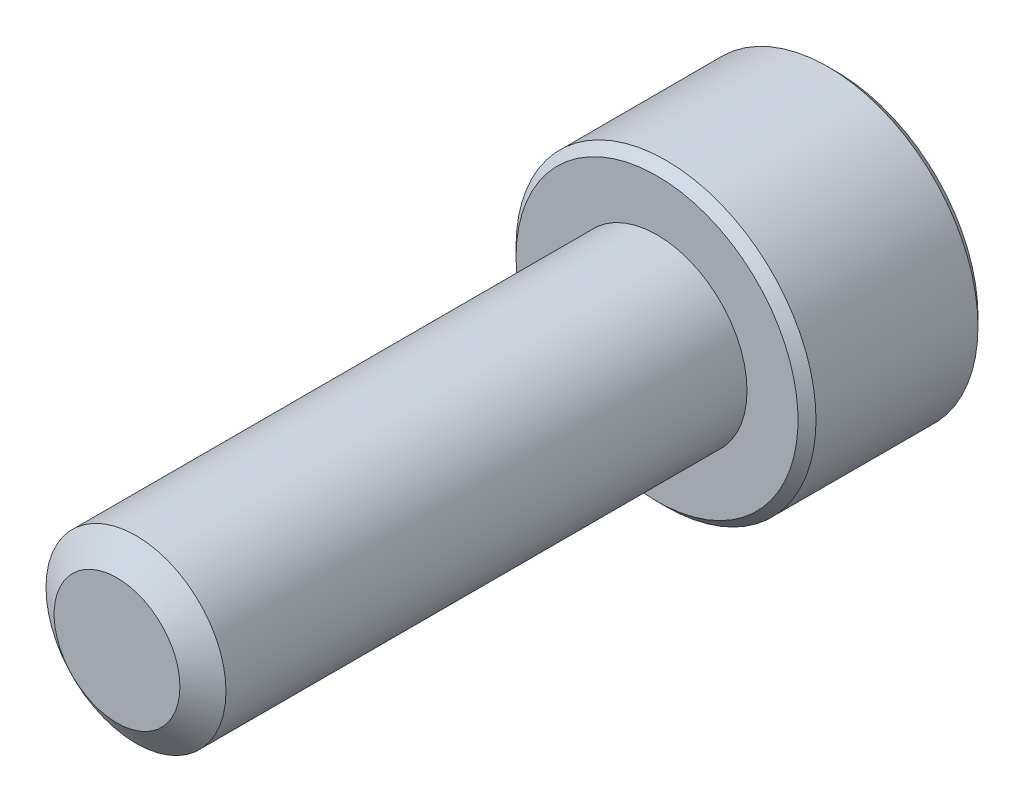
ISO-10303-21;
HEADER;
FILE_DESCRIPTION(('STEP AP214'),'2;1');
FILE_NAME('part.step','',(''),(''),'','','');
FILE_SCHEMA(('AUTOMOTIVE_DESIGN { 1 0 10303 214 1 1 1 1 }'));
ENDSEC;
DATA;
#1=APPLICATION_CONTEXT('core data for automotive mechanical design processes');
#2=APPLICATION_PROTOCOL_DEFINITION('international standard','automotive_design',2000,#1);
#3=PRODUCT_CONTEXT('',#1,'mechanical');
#4=PRODUCT('Part','Part','',(#3));
#5=PRODUCT_RELATED_PRODUCT_CATEGORY('part','',(#4));
#6=PRODUCT_DEFINITION_FORMATION('','',#4);
#7=PRODUCT_DEFINITION_CONTEXT('part definition',#1,'design');
#8=PRODUCT_DEFINITION('design','',#6,#7);
#9=PRODUCT_DEFINITION_SHAPE('','',#8);
#10=(LENGTH_UNIT() NAMED_UNIT(*) SI_UNIT(.MILLI.,.METRE.));
#11=(NAMED_UNIT(*) PLANE_ANGLE_UNIT() SI_UNIT($,.RADIAN.));
#12=(NAMED_UNIT(*) SI_UNIT($,.STERADIAN.) SOLID_ANGLE_UNIT());
#13=UNCERTAINTY_MEASURE_WITH_UNIT(LENGTH_MEASURE(1.E-05),#10,'distance_accuracy_value','');
#14=(GEOMETRIC_REPRESENTATION_CONTEXT(3) GLOBAL_UNCERTAINTY_ASSIGNED_CONTEXT((#13)) GLOBAL_UNIT_ASSIGNED_CONTEXT((#10,
#11,#12)) REPRESENTATION_CONTEXT('',''));
#15=CARTESIAN_POINT('',(0.,0.,0.));
#16=DIRECTION('',(0.,0.,1.));
#17=DIRECTION('',(1.,0.,0.));
#18=AXIS2_PLACEMENT_3D('',#15,#16,#17);
#19=CARTESIAN_POINT('',(0.,0.,-18.));
#20=DIRECTION('',(0.,0.,1.));
#21=DIRECTION('',(1.,0.,0.));
#22=AXIS2_PLACEMENT_3D('',#19,#20,#21);
#23=CYLINDRICAL_SURFACE('',#22,3.);
#24=CARTESIAN_POINT('',(0.,0.,-0.632650851713494));
#25=DIRECTION('',(0.,0.,1.));
#26=DIRECTION('',(1.,0.,0.));
#27=AXIS2_PLACEMENT_3D('',#24,#25,#26);
#28=CIRCLE('',#27,3.);
#29=CARTESIAN_POINT('',(3.,0.,-0.632650851713494));
#30=VERTEX_POINT('',#29);
#31=EDGE_CURVE('E112',#30,#30,#28,.T.);
#32=ORIENTED_EDGE('',*,*,#31,.F.);
#33=EDGE_LOOP('',(#32));
#34=FACE_BOUND('',#33,.T.);
#35=CARTESIAN_POINT('',(0.,0.,-18.));
#36=DIRECTION('',(0.,0.,-1.));
#37=DIRECTION('',(-1.,0.,0.));
#38=AXIS2_PLACEMENT_3D('',#35,#36,#37);
#39=CIRCLE('',#38,3.);
#40=CARTESIAN_POINT('',(-3.,0.,-18.));
#41=VERTEX_POINT('',#40);
#42=EDGE_CURVE('E218',#41,#41,#39,.F.);
#43=ORIENTED_EDGE('',*,*,#42,.T.);
#44=EDGE_LOOP('',(#43));
#45=FACE_BOUND('',#44,.T.);
#46=ADVANCED_FACE('F38',(#34,#45),#23,.T.);
#47=CARTESIAN_POINT('',(0.,0.,0.));
#48=DIRECTION('',(0.,0.,-1.));
#49=DIRECTION('',(-1.,0.,0.));
#50=AXIS2_PLACEMENT_3D('',#47,#48,#49);
#51=CONICAL_SURFACE('',#50,2.09648094716167,0.959931088596884);
#52=ORIENTED_EDGE('',*,*,#31,.T.);
#53=EDGE_LOOP('',(#52));
#54=FACE_BOUND('',#53,.T.);
#55=CARTESIAN_POINT('',(0.,0.,0.));
#56=DIRECTION('',(0.,0.,1.));
#57=DIRECTION('',(1.,0.,0.));
#58=AXIS2_PLACEMENT_3D('',#55,#56,#57);
#59=CIRCLE('',#58,2.09648094716167);
#60=CARTESIAN_POINT('',(2.09648094716167,0.,0.));
#61=VERTEX_POINT('',#60);
#62=EDGE_CURVE('E216',#61,#61,#59,.T.);
#63=ORIENTED_EDGE('',*,*,#62,.F.);
#64=EDGE_LOOP('',(#63));
#65=FACE_BOUND('',#64,.T.);
#66=ADVANCED_FACE('F199',(#54,#65),#51,.T.);
#67=CARTESIAN_POINT('',(0.,0.,0.));
#68=DIRECTION('',(0.,0.,1.));
#69=DIRECTION('',(1.,0.,0.));
#70=AXIS2_PLACEMENT_3D('',#67,#68,#69);
#71=PLANE('',#70);
#72=ORIENTED_EDGE('',*,*,#62,.T.);
#73=EDGE_LOOP('',(#72));
#74=FACE_BOUND('',#73,.T.);
#75=ADVANCED_FACE('F196',(#74),#71,.T.);
#76=CARTESIAN_POINT('',(0.,0.,-24.));
#77=DIRECTION('',(0.,0.,1.));
#78=DIRECTION('',(1.,0.,0.));
#79=AXIS2_PLACEMENT_3D('',#76,#77,#78);
#80=CYLINDRICAL_SURFACE('',#79,5.);
#81=CARTESIAN_POINT('',(0.,0.,-23.7));
#82=DIRECTION('',(0.,0.,-1.));
#83=DIRECTION('',(-1.,0.,0.));
#84=AXIS2_PLACEMENT_3D('',#81,#82,#83);
#85=CIRCLE('',#84,5.);
#86=CARTESIAN_POINT('',(5.,0.,-23.7));
#87=VERTEX_POINT('',#86);
#88=EDGE_CURVE('E46',#87,#87,#85,.F.);
#89=CARTESIAN_POINT('',(0.,0.,-18.3));
#90=DIRECTION('',(0.,0.,-1.));
#91=DIRECTION('',(-1.,0.,0.));
#92=AXIS2_PLACEMENT_3D('',#89,#90,#91);
#93=CIRCLE('',#92,5.);
#94=CARTESIAN_POINT('',(5.,0.,-18.3));
#95=VERTEX_POINT('',#94);
#96=EDGE_CURVE('E175',#95,#95,#93,.T.);
#97=CARTESIAN_POINT('',(5.,0.,-23.7));
#98=CARTESIAN_POINT('',(5.,0.,-23.64375));
#99=CARTESIAN_POINT('',(5.,0.,-23.5875));
#100=CARTESIAN_POINT('',(5.,0.,-23.475));
#101=CARTESIAN_POINT('',(5.,0.,-23.41875));
#102=CARTESIAN_POINT('',(5.,0.,-23.30625));
#103=CARTESIAN_POINT('',(5.,0.,-23.25));
#104=CARTESIAN_POINT('',(5.,0.,-23.1375));
#105=CARTESIAN_POINT('',(5.,0.,-23.08125));
#106=CARTESIAN_POINT('',(5.,0.,-22.96875));
#107=CARTESIAN_POINT('',(5.,0.,-22.9125));
#108=CARTESIAN_POINT('',(5.,0.,-22.8));
#109=CARTESIAN_POINT('',(5.,0.,-22.74375));
#110=CARTESIAN_POINT('',(5.,0.,-22.63125));
#111=CARTESIAN_POINT('',(5.,0.,-22.575));
#112=CARTESIAN_POINT('',(5.,0.,-22.4625));
#113=CARTESIAN_POINT('',(5.,0.,-22.40625));
#114=CARTESIAN_POINT('',(5.,0.,-22.29375));
#115=CARTESIAN_POINT('',(5.,0.,-22.2375));
#116=CARTESIAN_POINT('',(5.,0.,-22.125));
#117=CARTESIAN_POINT('',(5.,0.,-22.06875));
#118=CARTESIAN_POINT('',(5.,0.,-21.95625));
#119=CARTESIAN_POINT('',(5.,0.,-21.9));
#120=CARTESIAN_POINT('',(5.,0.,-21.7875));
#121=CARTESIAN_POINT('',(5.,0.,-21.73125));
#122=CARTESIAN_POINT('',(5.,0.,-21.61875));
#123=CARTESIAN_POINT('',(5.,0.,-21.5625));
#124=CARTESIAN_POINT('',(5.,0.,-21.45));
#125=CARTESIAN_POINT('',(5.,0.,-21.39375));
#126=CARTESIAN_POINT('',(5.,0.,-21.28125));
#127=CARTESIAN_POINT('',(5.,0.,-21.225));
#128=CARTESIAN_POINT('',(5.,0.,-21.1125));
#129=CARTESIAN_POINT('',(5.,0.,-21.05625));
#130=CARTESIAN_POINT('',(5.,0.,-20.94375));
#131=CARTESIAN_POINT('',(5.,0.,-20.8875));
#132=CARTESIAN_POINT('',(5.,0.,-20.775));
#133=CARTESIAN_POINT('',(5.,0.,-20.71875));
#134=CARTESIAN_POINT('',(5.,0.,-20.60625));
#135=CARTESIAN_POINT('',(5.,0.,-20.55));
#136=CARTESIAN_POINT('',(5.,0.,-20.4375));
#137=CARTESIAN_POINT('',(5.,0.,-20.38125));
#138=CARTESIAN_POINT('',(5.,0.,-20.26875));
#139=CARTESIAN_POINT('',(5.,0.,-20.2125));
#140=CARTESIAN_POINT('',(5.,0.,-20.1));
#141=CARTESIAN_POINT('',(5.,0.,-20.04375));
#142=CARTESIAN_POINT('',(5.,0.,-19.93125));
#143=CARTESIAN_POINT('',(5.,0.,-19.875));
#144=CARTESIAN_POINT('',(5.,0.,-19.7625));
#145=CARTESIAN_POINT('',(5.,0.,-19.70625));
#146=CARTESIAN_POINT('',(5.,0.,-19.59375));
#147=CARTESIAN_POINT('',(5.,0.,-19.5375));
#148=CARTESIAN_POINT('',(5.,0.,-19.425));
#149=CARTESIAN_POINT('',(5.,0.,-19.36875));
#150=CARTESIAN_POINT('',(5.,0.,-19.25625));
#151=CARTESIAN_POINT('',(5.,0.,-19.2));
#152=CARTESIAN_POINT('',(5.,0.,-19.0875));
#153=CARTESIAN_POINT('',(5.,0.,-19.03125));
#154=CARTESIAN_POINT('',(5.,0.,-18.91875));
#155=CARTESIAN_POINT('',(5.,0.,-18.8625));
#156=CARTESIAN_POINT('',(5.,0.,-18.75));
#157=CARTESIAN_POINT('',(5.,0.,-18.69375));
#158=CARTESIAN_POINT('',(5.,0.,-18.58125));
#159=CARTESIAN_POINT('',(5.,0.,-18.525));
#160=CARTESIAN_POINT('',(5.,0.,-18.4125));
#161=CARTESIAN_POINT('',(5.,0.,-18.35625));
#162=CARTESIAN_POINT('',(5.,0.,-18.3));
#163=B_SPLINE_CURVE_WITH_KNOTS('',3,(#97,#98,#99,#100,#101,#102,#103,#104,#105,#106,#107,#108,
#109,#110,#111,#112,#113,#114,#115,#116,#117,#118,#119,#120,#121,#122,#123,#124,#125,#126,#127,
#128,#129,#130,#131,#132,#133,#134,#135,#136,#137,#138,#139,#140,#141,#142,#143,#144,#145,#146,
#147,#148,#149,#150,#151,#152,#153,#154,#155,#156,#157,#158,#159,#160,#161,#162),.UNSPECIFIED.,
.F.,.F.,(4,2,2,2,2,2,2,2,2,2,2,2,2,2,2,2,2,2,2,2,2,2,2,2,2,2,2,2,2,2,2,2,4),(0.,
0.168749999999999,0.337499999999998,0.506249999999996,0.674999999999998,0.843749999999997,
1.0125,1.18124999999999,1.35,1.51875,1.68749999999999,1.85625,2.025,2.19374999999999,2.3625,
2.53125,2.69999999999999,2.86874999999999,3.03749999999999,3.20624999999999,3.37499999999999,
3.54374999999999,3.71249999999999,3.88124999999999,4.04999999999999,4.21874999999999,
4.38749999999999,4.55624999999999,4.72499999999999,4.89374999999999,5.06249999999999,
5.23124999999999,5.39999999999999),.UNSPECIFIED.);
#164=EDGE_CURVE('BSEAM180',#87,#95,#163,.T.);
#165=ORIENTED_EDGE('',*,*,#88,.T.);
#166=ORIENTED_EDGE('',*,*,#96,.T.);
#167=ORIENTED_EDGE('',*,*,#164,.T.);
#168=ORIENTED_EDGE('',*,*,#164,.F.);
#169=EDGE_LOOP('',(#165,#167,#166,#168));
#170=FACE_BOUND('',#169,.T.);
#171=ADVANCED_FACE('F180',(#170),#80,.T.);
#172=CARTESIAN_POINT('',(0.,0.,-24.));
#173=DIRECTION('',(0.,0.,-1.));
#174=DIRECTION('',(-1.,0.,0.));
#175=AXIS2_PLACEMENT_3D('',#172,#173,#174);
#176=PLANE('',#175);
#177=CARTESIAN_POINT('',(0.,0.,-24.));
#178=DIRECTION('',(0.,0.,-1.));
#179=DIRECTION('',(-1.,0.,0.));
#180=AXIS2_PLACEMENT_3D('',#177,#178,#179);
#181=CIRCLE('',#180,4.69999999999999);
#182=CARTESIAN_POINT('',(4.69999999999999,0.,-24.));
#183=VERTEX_POINT('',#182);
#184=EDGE_CURVE('E111',#183,#183,#181,.T.);
#185=ORIENTED_EDGE('',*,*,#184,.T.);
#186=EDGE_LOOP('',(#185));
#187=FACE_BOUND('',#186,.T.);
#188=CARTESIAN_POINT('',(0.,0.,-24.));
#189=DIRECTION('',(0.,0.,-1.));
#190=DIRECTION('',(-1.,0.,0.));
#191=AXIS2_PLACEMENT_3D('',#188,#189,#190);
#192=CIRCLE('',#191,2.88675134594813);
#193=CARTESIAN_POINT('',(-2.5,1.44337567297407,-24.));
#194=VERTEX_POINT('',#193);
#195=CARTESIAN_POINT('',(0.,2.88675134594813,-24.));
#196=VERTEX_POINT('',#195);
#197=EDGE_CURVE('E92',#194,#196,#192,.T.);
#198=ORIENTED_EDGE('',*,*,#197,.F.);
#199=CARTESIAN_POINT('',(-2.5,-1.44337567297406,-24.));
#200=VERTEX_POINT('',#199);
#201=EDGE_CURVE('E52',#200,#194,#192,.T.);
#202=ORIENTED_EDGE('',*,*,#201,.F.);
#203=CARTESIAN_POINT('',(0.,-2.88675134594813,-24.));
#204=VERTEX_POINT('',#203);
#205=EDGE_CURVE('E278',#204,#200,#192,.T.);
#206=ORIENTED_EDGE('',*,*,#205,.F.);
#207=CARTESIAN_POINT('',(2.5,-1.44337567297406,-24.));
#208=VERTEX_POINT('',#207);
#209=EDGE_CURVE('E59',#208,#204,#192,.T.);
#210=ORIENTED_EDGE('',*,*,#209,.F.);
#211=CARTESIAN_POINT('',(2.5,1.44337567297407,-24.));
#212=VERTEX_POINT('',#211);
#213=EDGE_CURVE('E133',#212,#208,#192,.T.);
#214=ORIENTED_EDGE('',*,*,#213,.F.);
#215=EDGE_CURVE('E101',#196,#212,#192,.T.);
#216=ORIENTED_EDGE('',*,*,#215,.F.);
#217=EDGE_LOOP('',(#198,#202,#206,#210,#214,#216));
#218=FACE_BOUND('',#217,.T.);
#219=ADVANCED_FACE('F132',(#187,#218),#176,.T.);
#220=CARTESIAN_POINT('',(0.,0.,-18.));
#221=DIRECTION('',(0.,0.,-1.));
#222=DIRECTION('',(-1.,0.,0.));
#223=AXIS2_PLACEMENT_3D('',#220,#221,#222);
#224=PLANE('',#223);
#225=CARTESIAN_POINT('',(0.,0.,-18.));
#226=DIRECTION('',(0.,0.,-1.));
#227=DIRECTION('',(-1.,0.,0.));
#228=AXIS2_PLACEMENT_3D('',#225,#226,#227);
#229=CIRCLE('',#228,4.69999999999999);
#230=CARTESIAN_POINT('',(-4.69999999999999,0.,-18.));
#231=VERTEX_POINT('',#230);
#232=EDGE_CURVE('E11',#231,#231,#229,.F.);
#233=ORIENTED_EDGE('',*,*,#232,.T.);
#234=EDGE_LOOP('',(#233));
#235=FACE_BOUND('',#234,.T.);
#236=ORIENTED_EDGE('',*,*,#42,.F.);
#237=EDGE_LOOP('',(#236));
#238=FACE_BOUND('',#237,.T.);
#239=ADVANCED_FACE('F189',(#235,#238),#224,.F.);
#240=CARTESIAN_POINT('',(0.,0.,-24.));
#241=DIRECTION('',(0.,0.,-1.));
#242=DIRECTION('',(-1.,0.,0.));
#243=AXIS2_PLACEMENT_3D('',#240,#241,#242);
#244=CONICAL_SURFACE('',#243,2.88675134594813,0.78539816339745);
#245=ORIENTED_EDGE('',*,*,#215,.T.);
#246=CARTESIAN_POINT('',(-0.000200000000000246,2.88686681600197,-24.0001154769818));
#247=CARTESIAN_POINT('',(0.0857382777877644,2.83725032818751,-23.9505407053547));
#248=CARTESIAN_POINT('',(0.173113567275753,2.7868041812811,-23.9038774813625));
#249=CARTESIAN_POINT('',(0.351281456165589,2.6839389026696,-23.8184381400383));
#250=CARTESIAN_POINT('',(0.442091000681075,2.6315099876986,-23.779709562406));
#251=CARTESIAN_POINT('',(0.625204123126922,2.52578957716234,-23.7133667038977));
#252=CARTESIAN_POINT('',(0.717461064529341,2.47252500720904,-23.6855856685309));
#253=CARTESIAN_POINT('',(0.904006008776286,2.3648232334321,-23.6427831759107));
#254=CARTESIAN_POINT('',(0.998288312566283,2.31038931995913,-23.6277297666713));
#255=CARTESIAN_POINT('',(1.16077825829185,2.21657570605387,-23.6141477222095));
#256=CARTESIAN_POINT('',(1.22877596788015,2.17731721011878,-23.6121370992408));
#257=CARTESIAN_POINT('',(1.36466024116922,2.0988643883567,-23.6155241171875));
#258=CARTESIAN_POINT('',(1.43254675755224,2.05967008984862,-23.6209243552998));
#259=CARTESIAN_POINT('',(1.56767878823611,1.98165157555715,-23.6388257884025));
#260=CARTESIAN_POINT('',(1.63492349975356,1.94282782326097,-23.6513349270465));
#261=CARTESIAN_POINT('',(1.7682501008182,1.86585167424616,-23.6827675019557));
#262=CARTESIAN_POINT('',(1.83433207909966,1.82769922629678,-23.7016904464968));
#263=CARTESIAN_POINT('',(2.00359634669126,1.72997445583858,-23.7578673614082));
#264=CARTESIAN_POINT('',(2.10572912222289,1.67100807039231,-23.7993558315962));
#265=CARTESIAN_POINT('',(2.25590641494051,1.58430317001562,-23.8693940467231));
#266=CARTESIAN_POINT('',(2.30539653988261,1.55573003305807,-23.8940022521161));
#267=CARTESIAN_POINT('',(2.40346006383885,1.49911303110426,-23.9454618867152));
#268=CARTESIAN_POINT('',(2.45203400349693,1.47106885396706,-23.9723119387794));
#269=CARTESIAN_POINT('',(2.5002,1.44326020292023,-24.0001154769818));
#270=B_SPLINE_CURVE_WITH_KNOTS('',3,(#246,#247,#248,#249,#250,#251,#252,#253,#254,#255,#256,
#257,#258,#259,#260,#261,#262,#263,#264,#265,#266,#267,#268,#269),.UNSPECIFIED.,.F.,.F.,(4,2,2,
2,2,2,2,2,2,2,2,4),(0.,0.333012085133925,0.667964518301399,0.9975970320433,1.32639954393844,
1.56169424147169,1.79707142102083,2.03271213522171,2.26833478775651,2.64260240809533,
2.82922877818864,3.01574133749025),.UNSPECIFIED.);
#271=EDGE_CURVE('E106',#196,#212,#270,.T.);
#272=ORIENTED_EDGE('',*,*,#271,.F.);
#273=EDGE_LOOP('',(#245,#272));
#274=FACE_BOUND('',#273,.T.);
#275=ADVANCED_FACE('F107',(#274),#244,.F.);
#276=ORIENTED_EDGE('',*,*,#213,.T.);
#277=CARTESIAN_POINT('',(2.5,-2.87868021616154,-24.9259641937847));
#278=CARTESIAN_POINT('',(2.5,-2.80858751756355,-24.8730547693995));
#279=CARTESIAN_POINT('',(2.5,-2.73810237384457,-24.8206567848064));
#280=CARTESIAN_POINT('',(2.5,-2.59619238907469,-24.7171126835152));
#281=CARTESIAN_POINT('',(2.5,-2.52476731657143,-24.6659668843779));
#282=CARTESIAN_POINT('',(2.5,-2.38030019419698,-24.5647924979814));
#283=CARTESIAN_POINT('',(2.5,-2.307249903594,-24.5147756377845));
#284=CARTESIAN_POINT('',(2.5,-2.15990937397294,-24.4166088439155));
#285=CARTESIAN_POINT('',(2.5,-2.08561922308943,-24.3684587783455));
#286=CARTESIAN_POINT('',(2.5,-1.93130274871409,-24.271746559452));
#287=CARTESIAN_POINT('',(2.5,-1.8511916849785,-24.2233189325373));
#288=CARTESIAN_POINT('',(2.5,-1.68912282627168,-24.1296640597041));
#289=CARTESIAN_POINT('',(2.5,-1.60716527674864,-24.0844363916948));
#290=CARTESIAN_POINT('',(2.5,-1.44137668632319,-23.9981353746693));
#291=CARTESIAN_POINT('',(2.5,-1.35755175925796,-23.9570503726636));
#292=CARTESIAN_POINT('',(2.5,-1.1876157775942,-23.8799618661066));
#293=CARTESIAN_POINT('',(2.5,-1.10150577924729,-23.8439560607346));
#294=CARTESIAN_POINT('',(2.5,-0.933895283730372,-23.7809497442851));
#295=CARTESIAN_POINT('',(2.5,-0.85258148665241,-23.7534577201431));
#296=CARTESIAN_POINT('',(2.5,-0.687996185051424,-23.7049971144174));
#297=CARTESIAN_POINT('',(2.5,-0.604724546085161,-23.684028982239));
#298=CARTESIAN_POINT('',(2.5,-0.438105786501648,-23.650059995013));
#299=CARTESIAN_POINT('',(2.5,-0.35478695737788,-23.6369226334436));
#300=CARTESIAN_POINT('',(2.5,-0.187258638268772,-23.6188701943996));
#301=CARTESIAN_POINT('',(2.5,-0.103049303891732,-23.6139537035302));
#302=CARTESIAN_POINT('',(2.5,0.0623819458555497,-23.6127080743719));
#303=CARTESIAN_POINT('',(2.5,0.143601667742495,-23.6160745517109));
#304=CARTESIAN_POINT('',(2.5,0.305344840533965,-23.6305375923809));
#305=CARTESIAN_POINT('',(2.5,0.385868223029658,-23.6416349066531));
#306=CARTESIAN_POINT('',(2.5,0.546999992477731,-23.6711420785853));
#307=CARTESIAN_POINT('',(2.5,0.62758525815638,-23.6896763768309));
#308=CARTESIAN_POINT('',(2.5,0.786991930978588,-23.7330723320141));
#309=CARTESIAN_POINT('',(2.5,0.865813485110825,-23.7579334595174));
#310=CARTESIAN_POINT('',(2.5,1.11399280220491,-23.8455589112399));
#311=CARTESIAN_POINT('',(2.5,1.27984027529456,-23.9183033354746));
#312=CARTESIAN_POINT('',(2.5,1.52253018655038,-24.0395423452678));
#313=CARTESIAN_POINT('',(2.5,1.60256472908879,-24.0820714512072));
#314=CARTESIAN_POINT('',(2.5,1.76081489282124,-24.1703965241522));
#315=CARTESIAN_POINT('',(2.5,1.83903083842887,-24.2161919024767));
#316=CARTESIAN_POINT('',(2.5,1.99000684607168,-24.3080446787286));
#317=CARTESIAN_POINT('',(2.5,2.06284472030444,-24.3539756354245));
#318=CARTESIAN_POINT('',(2.5,2.20727164736135,-24.4477702453865));
#319=CARTESIAN_POINT('',(2.5,2.27886060500402,-24.4956340450436));
#320=CARTESIAN_POINT('',(2.5,2.42037078548403,-24.5925522363183));
#321=CARTESIAN_POINT('',(2.5,2.49030083172878,-24.6415937983162));
#322=CARTESIAN_POINT('',(2.5,2.62920524991558,-24.7409738351898));
#323=CARTESIAN_POINT('',(2.5,2.69817987937839,-24.7913119497074));
#324=CARTESIAN_POINT('',(2.5,2.76675463365823,-24.8421802976824));
#325=B_SPLINE_CURVE_WITH_KNOTS('',3,(#277,#278,#279,#280,#281,#282,#283,#284,#285,#286,#287,
#288,#289,#290,#291,#292,#293,#294,#295,#296,#297,#298,#299,#300,#301,#302,#303,#304,#305,#306,
#307,#308,#309,#310,#311,#312,#313,#314,#315,#316,#317,#318,#319,#320,#321,#322,#323,#324),
.UNSPECIFIED.,.F.,.F.,(4,2,2,2,2,2,2,2,2,2,2,2,2,2,2,2,2,2,2,2,2,2,2,4),(0.,0.263465914971116,
0.526997968323237,0.792571943279359,1.05812711983771,1.33890112548018,1.61963802629079,
1.89956181222216,2.17935838571897,2.436638876826,2.69393708705248,2.94660788173135,
3.19923523085016,3.44271854486786,3.68622551313359,3.93398926860573,4.18173229781968,
4.72334004841908,4.99521600382014,5.26704308216966,5.52534341671993,5.78366335141086,
6.03988492204046,6.29603603207541),.UNSPECIFIED.);
#326=EDGE_CURVE('E100',#212,#208,#325,.F.);
#327=ORIENTED_EDGE('',*,*,#326,.F.);
#328=EDGE_LOOP('',(#276,#327));
#329=FACE_BOUND('',#328,.T.);
#330=ADVANCED_FACE('F284',(#329),#244,.F.);
#331=ORIENTED_EDGE('',*,*,#209,.T.);
#332=CARTESIAN_POINT('',(2.5002,-1.44326020292023,-24.0001154769818));
#333=CARTESIAN_POINT('',(2.41426172221224,-1.49287669073469,-23.9505407053547));
#334=CARTESIAN_POINT('',(2.32688643272425,-1.5433228376411,-23.9038774813625));
#335=CARTESIAN_POINT('',(2.14871854383441,-1.64618811625259,-23.8184381400383));
#336=CARTESIAN_POINT('',(2.05790899931893,-1.69861703122359,-23.779709562406));
#337=CARTESIAN_POINT('',(1.87479587687308,-1.80433744175986,-23.7133667038977));
#338=CARTESIAN_POINT('',(1.78253893547066,-1.85760201171316,-23.6855856685309));
#339=CARTESIAN_POINT('',(1.59599399122371,-1.96530378549009,-23.6427831759107));
#340=CARTESIAN_POINT('',(1.50171168743372,-2.01973769896307,-23.6277297666713));
#341=CARTESIAN_POINT('',(1.33922174170816,-2.11355131286833,-23.6141477222095));
#342=CARTESIAN_POINT('',(1.27122403211985,-2.15280980880341,-23.6121370992408));
#343=CARTESIAN_POINT('',(1.13533975883078,-2.23126263056549,-23.6155241171875));
#344=CARTESIAN_POINT('',(1.06745324244776,-2.27045692907357,-23.6209243552998));
#345=CARTESIAN_POINT('',(0.932321211763895,-2.34847544336505,-23.6388257884025));
#346=CARTESIAN_POINT('',(0.86507650024644,-2.38729919566123,-23.6513349270465));
#347=CARTESIAN_POINT('',(0.731749899181802,-2.46427534467604,-23.6827675019557));
#348=CARTESIAN_POINT('',(0.665667920900344,-2.50242779262542,-23.7016904464968));
#349=CARTESIAN_POINT('',(0.496403653308736,-2.60015256308362,-23.7578673614082));
#350=CARTESIAN_POINT('',(0.394270877777108,-2.65911894852989,-23.7993558315962));
#351=CARTESIAN_POINT('',(0.244093585059492,-2.74582384890657,-23.8693940467231));
#352=CARTESIAN_POINT('',(0.194603460117392,-2.77439698586412,-23.8940022521161));
#353=CARTESIAN_POINT('',(0.0965399361611549,-2.83101398781794,-23.9454618867152));
#354=CARTESIAN_POINT('',(0.047965996503074,-2.85905816495513,-23.9723119387794));
#355=CARTESIAN_POINT('',(-0.000199999999997863,-2.88686681600197,-24.0001154769818));
#356=B_SPLINE_CURVE_WITH_KNOTS('',3,(#332,#333,#334,#335,#336,#337,#338,#339,#340,#341,#342,
#343,#344,#345,#346,#347,#348,#349,#350,#351,#352,#353,#354,#355),.UNSPECIFIED.,.F.,.F.,(4,2,2,
2,2,2,2,2,2,2,2,4),(0.,0.333012085133925,0.667964518301399,0.997597032043301,1.32639954393844,
1.56169424147169,1.79707142102083,2.03271213522171,2.26833478775651,2.64260240809533,
2.82922877818864,3.01574133749025),.UNSPECIFIED.);
#357=EDGE_CURVE('E143',#208,#204,#356,.T.);
#358=ORIENTED_EDGE('',*,*,#357,.F.);
#359=EDGE_LOOP('',(#331,#358));
#360=FACE_BOUND('',#359,.T.);
#361=ADVANCED_FACE('F281',(#360),#244,.F.);
#362=ORIENTED_EDGE('',*,*,#205,.T.);
#363=CARTESIAN_POINT('',(0.000200000000001078,-2.88686681600197,-24.0001154769818));
#364=CARTESIAN_POINT('',(-0.0857382777877632,-2.83725032818751,-23.9505407053547));
#365=CARTESIAN_POINT('',(-0.173113567275751,-2.7868041812811,-23.9038774813625));
#366=CARTESIAN_POINT('',(-0.351281456165587,-2.6839389026696,-23.8184381400383));
#367=CARTESIAN_POINT('',(-0.442091000681074,-2.6315099876986,-23.779709562406));
#368=CARTESIAN_POINT('',(-0.625204123126922,-2.52578957716234,-23.7133667038977));
#369=CARTESIAN_POINT('',(-0.717461064529342,-2.47252500720904,-23.6855856685309));
#370=CARTESIAN_POINT('',(-0.904006008776288,-2.3648232334321,-23.6427831759107));
#371=CARTESIAN_POINT('',(-0.998288312566286,-2.31038931995913,-23.6277297666713));
#372=CARTESIAN_POINT('',(-1.16077825829185,-2.21657570605386,-23.6141477222095));
#373=CARTESIAN_POINT('',(-1.22877596788015,-2.17731721011878,-23.6121370992408));
#374=CARTESIAN_POINT('',(-1.36466024116922,-2.0988643883567,-23.6155241171875));
#375=CARTESIAN_POINT('',(-1.43254675755224,-2.05967008984862,-23.6209243552998));
#376=CARTESIAN_POINT('',(-1.56767878823611,-1.98165157555714,-23.6388257884025));
#377=CARTESIAN_POINT('',(-1.63492349975356,-1.94282782326096,-23.6513349270465));
#378=CARTESIAN_POINT('',(-1.7682501008182,-1.86585167424616,-23.6827675019557));
#379=CARTESIAN_POINT('',(-1.83433207909966,-1.82769922629677,-23.7016904464968));
#380=CARTESIAN_POINT('',(-2.00359634669127,-1.72997445583857,-23.7578673614082));
#381=CARTESIAN_POINT('',(-2.10572912222289,-1.67100807039231,-23.7993558315962));
#382=CARTESIAN_POINT('',(-2.25590641494051,-1.58430317001562,-23.8693940467231));
#383=CARTESIAN_POINT('',(-2.30539653988261,-1.55573003305807,-23.8940022521161));
#384=CARTESIAN_POINT('',(-2.40346006383884,-1.49911303110426,-23.9454618867152));
#385=CARTESIAN_POINT('',(-2.45203400349693,-1.47106885396706,-23.9723119387794));
#386=CARTESIAN_POINT('',(-2.5002,-1.44326020292023,-24.0001154769818));
#387=B_SPLINE_CURVE_WITH_KNOTS('',3,(#363,#364,#365,#366,#367,#368,#369,#370,#371,#372,#373,
#374,#375,#376,#377,#378,#379,#380,#381,#382,#383,#384,#385,#386),.UNSPECIFIED.,.F.,.F.,(4,2,2,
2,2,2,2,2,2,2,2,4),(0.,0.333012085133924,0.6679645183014,0.997597032043304,1.32639954393845,
1.56169424147169,1.79707142102083,2.03271213522171,2.26833478775651,2.64260240809533,
2.82922877818864,3.01574133749025),.UNSPECIFIED.);
#388=EDGE_CURVE('E255',#204,#200,#387,.T.);
#389=ORIENTED_EDGE('',*,*,#388,.F.);
#390=EDGE_LOOP('',(#362,#389));
#391=FACE_BOUND('',#390,.T.);
#392=ADVANCED_FACE('F280',(#391),#244,.F.);
#393=ORIENTED_EDGE('',*,*,#201,.T.);
#394=CARTESIAN_POINT('',(-2.5,-2.87868021616154,-24.9259641937847));
#395=CARTESIAN_POINT('',(-2.5,-2.80858751756355,-24.8730547693995));
#396=CARTESIAN_POINT('',(-2.5,-2.73810237384457,-24.8206567848064));
#397=CARTESIAN_POINT('',(-2.5,-2.59619238907469,-24.7171126835152));
#398=CARTESIAN_POINT('',(-2.5,-2.52476731657143,-24.6659668843779));
#399=CARTESIAN_POINT('',(-2.5,-2.38030019419698,-24.5647924979814));
#400=CARTESIAN_POINT('',(-2.5,-2.307249903594,-24.5147756377845));
#401=CARTESIAN_POINT('',(-2.5,-2.15990937397294,-24.4166088439155));
#402=CARTESIAN_POINT('',(-2.5,-2.08561922308943,-24.3684587783455));
#403=CARTESIAN_POINT('',(-2.5,-1.93130274871408,-24.271746559452));
#404=CARTESIAN_POINT('',(-2.5,-1.8511916849785,-24.2233189325373));
#405=CARTESIAN_POINT('',(-2.5,-1.68912282627168,-24.1296640597041));
#406=CARTESIAN_POINT('',(-2.5,-1.60716527674864,-24.0844363916948));
#407=CARTESIAN_POINT('',(-2.5,-1.44137668632319,-23.9981353746693));
#408=CARTESIAN_POINT('',(-2.5,-1.35755175925796,-23.9570503726636));
#409=CARTESIAN_POINT('',(-2.5,-1.1876157775942,-23.8799618661066));
#410=CARTESIAN_POINT('',(-2.5,-1.10150577924729,-23.8439560607346));
#411=CARTESIAN_POINT('',(-2.5,-0.933895283730374,-23.7809497442851));
#412=CARTESIAN_POINT('',(-2.5,-0.852581486652411,-23.7534577201431));
#413=CARTESIAN_POINT('',(-2.5,-0.687996185051425,-23.7049971144174));
#414=CARTESIAN_POINT('',(-2.5,-0.604724546085163,-23.684028982239));
#415=CARTESIAN_POINT('',(-2.5,-0.43810578650165,-23.650059995013));
#416=CARTESIAN_POINT('',(-2.5,-0.354786957377882,-23.6369226334436));
#417=CARTESIAN_POINT('',(-2.5,-0.187258638268773,-23.6188701943996));
#418=CARTESIAN_POINT('',(-2.5,-0.103049303891733,-23.6139537035302));
#419=CARTESIAN_POINT('',(-2.5,0.0623819458555485,-23.6127080743719));
#420=CARTESIAN_POINT('',(-2.5,0.143601667742494,-23.6160745517109));
#421=CARTESIAN_POINT('',(-2.5,0.305344840533964,-23.6305375923809));
#422=CARTESIAN_POINT('',(-2.5,0.385868223029657,-23.6416349066531));
#423=CARTESIAN_POINT('',(-2.5,0.54699999247773,-23.6711420785853));
#424=CARTESIAN_POINT('',(-2.5,0.627585258156378,-23.6896763768309));
#425=CARTESIAN_POINT('',(-2.5,0.786991930978586,-23.7330723320141));
#426=CARTESIAN_POINT('',(-2.5,0.865813485110823,-23.7579334595174));
#427=CARTESIAN_POINT('',(-2.5,1.11399280220491,-23.8455589112399));
#428=CARTESIAN_POINT('',(-2.5,1.27984027529456,-23.9183033354746));
#429=CARTESIAN_POINT('',(-2.5,1.52253018655038,-24.0395423452678));
#430=CARTESIAN_POINT('',(-2.5,1.60256472908879,-24.0820714512072));
#431=CARTESIAN_POINT('',(-2.5,1.76081489282124,-24.1703965241522));
#432=CARTESIAN_POINT('',(-2.5,1.83903083842886,-24.2161919024767));
#433=CARTESIAN_POINT('',(-2.5,1.99000684607167,-24.3080446787286));
#434=CARTESIAN_POINT('',(-2.5,2.06284472030444,-24.3539756354245));
#435=CARTESIAN_POINT('',(-2.5,2.20727164736135,-24.4477702453865));
#436=CARTESIAN_POINT('',(-2.5,2.27886060500402,-24.4956340450436));
#437=CARTESIAN_POINT('',(-2.5,2.42037078548403,-24.5925522363183));
#438=CARTESIAN_POINT('',(-2.5,2.49030083172878,-24.6415937983162));
#439=CARTESIAN_POINT('',(-2.5,2.62920524991558,-24.7409738351898));
#440=CARTESIAN_POINT('',(-2.5,2.69817987937839,-24.7913119497074));
#441=CARTESIAN_POINT('',(-2.5,2.76675463365823,-24.8421802976824));
#442=B_SPLINE_CURVE_WITH_KNOTS('',3,(#394,#395,#396,#397,#398,#399,#400,#401,#402,#403,#404,
#405,#406,#407,#408,#409,#410,#411,#412,#413,#414,#415,#416,#417,#418,#419,#420,#421,#422,#423,
#424,#425,#426,#427,#428,#429,#430,#431,#432,#433,#434,#435,#436,#437,#438,#439,#440,#441),
.UNSPECIFIED.,.F.,.F.,(4,2,2,2,2,2,2,2,2,2,2,2,2,2,2,2,2,2,2,2,2,2,2,4),(0.,0.263465914971115,
0.526997968323237,0.792571943279359,1.05812711983771,1.33890112548018,1.61963802629079,
1.89956181222216,2.17935838571897,2.436638876826,2.69393708705248,2.94660788173135,
3.19923523085015,3.44271854486786,3.68622551313359,3.93398926860573,4.18173229781968,
4.72334004841907,4.99521600382014,5.26704308216966,5.52534341671993,5.78366335141086,
6.03988492204046,6.29603603207541),.UNSPECIFIED.);
#443=EDGE_CURVE('E122',#200,#194,#442,.T.);
#444=ORIENTED_EDGE('',*,*,#443,.F.);
#445=EDGE_LOOP('',(#393,#444));
#446=FACE_BOUND('',#445,.T.);
#447=ADVANCED_FACE('F293',(#446),#244,.F.);
#448=ORIENTED_EDGE('',*,*,#197,.T.);
#449=CARTESIAN_POINT('',(-2.5002,1.44326020292023,-24.0001154769818));
#450=CARTESIAN_POINT('',(-2.41426172221224,1.49287669073469,-23.9505407053547));
#451=CARTESIAN_POINT('',(-2.32688643272425,1.5433228376411,-23.9038774813625));
#452=CARTESIAN_POINT('',(-2.14871854383441,1.64618811625259,-23.8184381400383));
#453=CARTESIAN_POINT('',(-2.05790899931893,1.69861703122359,-23.779709562406));
#454=CARTESIAN_POINT('',(-1.87479587687308,1.80433744175986,-23.7133667038977));
#455=CARTESIAN_POINT('',(-1.78253893547066,1.85760201171316,-23.6855856685309));
#456=CARTESIAN_POINT('',(-1.59599399122371,1.96530378549009,-23.6427831759107));
#457=CARTESIAN_POINT('',(-1.50171168743372,2.01973769896307,-23.6277297666713));
#458=CARTESIAN_POINT('',(-1.33922174170816,2.11355131286833,-23.6141477222095));
#459=CARTESIAN_POINT('',(-1.27122403211985,2.15280980880341,-23.6121370992408));
#460=CARTESIAN_POINT('',(-1.13533975883078,2.23126263056549,-23.6155241171875));
#461=CARTESIAN_POINT('',(-1.06745324244776,2.27045692907358,-23.6209243552998));
#462=CARTESIAN_POINT('',(-0.932321211763895,2.34847544336505,-23.6388257884025));
#463=CARTESIAN_POINT('',(-0.86507650024644,2.38729919566123,-23.6513349270465));
#464=CARTESIAN_POINT('',(-0.731749899181802,2.46427534467604,-23.6827675019557));
#465=CARTESIAN_POINT('',(-0.665667920900344,2.50242779262542,-23.7016904464968));
#466=CARTESIAN_POINT('',(-0.496403653308736,2.60015256308362,-23.7578673614082));
#467=CARTESIAN_POINT('',(-0.394270877777107,2.65911894852989,-23.7993558315962));
#468=CARTESIAN_POINT('',(-0.244093585059491,2.74582384890657,-23.8693940467231));
#469=CARTESIAN_POINT('',(-0.19460346011739,2.77439698586412,-23.8940022521161));
#470=CARTESIAN_POINT('',(-0.0965399361611529,2.83101398781794,-23.9454618867152));
#471=CARTESIAN_POINT('',(-0.0479659965030715,2.85905816495513,-23.9723119387794));
#472=CARTESIAN_POINT('',(0.000200000000000497,2.88686681600197,-24.0001154769818));
#473=B_SPLINE_CURVE_WITH_KNOTS('',3,(#449,#450,#451,#452,#453,#454,#455,#456,#457,#458,#459,
#460,#461,#462,#463,#464,#465,#466,#467,#468,#469,#470,#471,#472),.UNSPECIFIED.,.F.,.F.,(4,2,2,
2,2,2,2,2,2,2,2,4),(0.,0.333012085133925,0.667964518301397,0.9975970320433,1.32639954393844,
1.56169424147169,1.79707142102083,2.03271213522171,2.26833478775651,2.64260240809533,
2.82922877818864,3.01574133749025),.UNSPECIFIED.);
#474=EDGE_CURVE('E96',#194,#196,#473,.T.);
#475=ORIENTED_EDGE('',*,*,#474,.F.);
#476=EDGE_LOOP('',(#448,#475));
#477=FACE_BOUND('',#476,.T.);
#478=ADVANCED_FACE('F94',(#477),#244,.F.);
#479=CARTESIAN_POINT('',(2.5,4.33012701892219,-20.25));
#480=DIRECTION('',(0.,0.,-1.));
#481=DIRECTION('',(-1.,0.,0.));
#482=AXIS2_PLACEMENT_3D('',#479,#480,#481);
#483=PLANE('',#482);
#484=DIRECTION('',(0.866025403784439,0.5,0.));
#485=VECTOR('',#484,1.);
#486=CARTESIAN_POINT('',(-2.5,1.44337567297407,-20.25));
#487=LINE('',#486,#485);
#488=CARTESIAN_POINT('',(-2.5,1.44337567297407,-20.25));
#489=VERTEX_POINT('',#488);
#490=CARTESIAN_POINT('',(0.,2.88675134594813,-20.25));
#491=VERTEX_POINT('',#490);
#492=EDGE_CURVE('E121',#489,#491,#487,.T.);
#493=ORIENTED_EDGE('',*,*,#492,.T.);
#494=DIRECTION('',(0.866025403784439,-0.5,0.));
#495=VECTOR('',#494,1.);
#496=CARTESIAN_POINT('',(0.,2.88675134594813,-20.25));
#497=LINE('',#496,#495);
#498=CARTESIAN_POINT('',(2.5,1.44337567297406,-20.25));
#499=VERTEX_POINT('',#498);
#500=EDGE_CURVE('E126',#491,#499,#497,.T.);
#501=ORIENTED_EDGE('',*,*,#500,.T.);
#502=DIRECTION('',(0.,-1.,0.));
#503=VECTOR('',#502,1.);
#504=CARTESIAN_POINT('',(2.5,1.44337567297406,-20.25));
#505=LINE('',#504,#503);
#506=CARTESIAN_POINT('',(2.5,-1.44337567297406,-20.25));
#507=VERTEX_POINT('',#506);
#508=EDGE_CURVE('E241',#499,#507,#505,.T.);
#509=ORIENTED_EDGE('',*,*,#508,.T.);
#510=DIRECTION('',(-0.866025403784439,-0.5,0.));
#511=VECTOR('',#510,1.);
#512=CARTESIAN_POINT('',(2.5,-1.44337567297406,-20.25));
#513=LINE('',#512,#511);
#514=CARTESIAN_POINT('',(0.,-2.88675134594813,-20.25));
#515=VERTEX_POINT('',#514);
#516=EDGE_CURVE('E238',#507,#515,#513,.T.);
#517=ORIENTED_EDGE('',*,*,#516,.T.);
#518=DIRECTION('',(-0.866025403784439,0.5,0.));
#519=VECTOR('',#518,1.);
#520=CARTESIAN_POINT('',(0.,-2.88675134594813,-20.25));
#521=LINE('',#520,#519);
#522=CARTESIAN_POINT('',(-2.5,-1.44337567297406,-20.25));
#523=VERTEX_POINT('',#522);
#524=EDGE_CURVE('E235',#515,#523,#521,.T.);
#525=ORIENTED_EDGE('',*,*,#524,.T.);
#526=DIRECTION('',(0.,1.,0.));
#527=VECTOR('',#526,1.);
#528=CARTESIAN_POINT('',(-2.5,-1.44337567297406,-20.25));
#529=LINE('',#528,#527);
#530=EDGE_CURVE('E129',#523,#489,#529,.T.);
#531=ORIENTED_EDGE('',*,*,#530,.T.);
#532=EDGE_LOOP('',(#493,#501,#509,#517,#525,#531));
#533=FACE_BOUND('',#532,.T.);
#534=ADVANCED_FACE('F163',(#533),#483,.T.);
#535=CARTESIAN_POINT('',(0.,2.88675134594813,-20.25));
#536=DIRECTION('',(0.5,0.866025403784439,0.));
#537=DIRECTION('',(-0.866025403784439,0.5,0.));
#538=AXIS2_PLACEMENT_3D('',#535,#536,#537);
#539=PLANE('',#538);
#540=DIRECTION('',(0.,0.,-1.));
#541=VECTOR('',#540,1.);
#542=CARTESIAN_POINT('',(0.,2.88675134594813,-20.25));
#543=LINE('',#542,#541);
#544=EDGE_CURVE('E118',#491,#196,#543,.T.);
#545=ORIENTED_EDGE('',*,*,#544,.T.);
#546=ORIENTED_EDGE('',*,*,#271,.T.);
#547=DIRECTION('',(0.,0.,-1.));
#548=VECTOR('',#547,1.);
#549=CARTESIAN_POINT('',(2.5,1.44337567297406,-20.25));
#550=LINE('',#549,#548);
#551=EDGE_CURVE('E128',#499,#212,#550,.T.);
#552=ORIENTED_EDGE('',*,*,#551,.F.);
#553=ORIENTED_EDGE('',*,*,#500,.F.);
#554=EDGE_LOOP('',(#545,#546,#552,#553));
#555=FACE_BOUND('',#554,.T.);
#556=ADVANCED_FACE('F124',(#555),#539,.F.);
#557=CARTESIAN_POINT('',(2.5,1.44337567297406,-20.25));
#558=DIRECTION('',(1.,0.,0.));
#559=DIRECTION('',(0.,0.,-1.));
#560=AXIS2_PLACEMENT_3D('',#557,#558,#559);
#561=PLANE('',#560);
#562=ORIENTED_EDGE('',*,*,#551,.T.);
#563=ORIENTED_EDGE('',*,*,#326,.T.);
#564=DIRECTION('',(0.,0.,-1.));
#565=VECTOR('',#564,1.);
#566=CARTESIAN_POINT('',(2.5,-1.44337567297406,-20.25));
#567=LINE('',#566,#565);
#568=EDGE_CURVE('E224',#507,#208,#567,.T.);
#569=ORIENTED_EDGE('',*,*,#568,.F.);
#570=ORIENTED_EDGE('',*,*,#508,.F.);
#571=EDGE_LOOP('',(#562,#563,#569,#570));
#572=FACE_BOUND('',#571,.T.);
#573=ADVANCED_FACE('F152',(#572),#561,.F.);
#574=CARTESIAN_POINT('',(2.5,-1.44337567297406,-20.25));
#575=DIRECTION('',(0.5,-0.866025403784439,0.));
#576=DIRECTION('',(0.866025403784439,0.5,0.));
#577=AXIS2_PLACEMENT_3D('',#574,#575,#576);
#578=PLANE('',#577);
#579=ORIENTED_EDGE('',*,*,#568,.T.);
#580=ORIENTED_EDGE('',*,*,#357,.T.);
#581=DIRECTION('',(0.,0.,-1.));
#582=VECTOR('',#581,1.);
#583=CARTESIAN_POINT('',(0.,-2.88675134594813,-20.25));
#584=LINE('',#583,#582);
#585=EDGE_CURVE('E227',#515,#204,#584,.T.);
#586=ORIENTED_EDGE('',*,*,#585,.F.);
#587=ORIENTED_EDGE('',*,*,#516,.F.);
#588=EDGE_LOOP('',(#579,#580,#586,#587));
#589=FACE_BOUND('',#588,.T.);
#590=ADVANCED_FACE('F156',(#589),#578,.F.);
#591=CARTESIAN_POINT('',(0.,-2.88675134594813,-20.25));
#592=DIRECTION('',(-0.5,-0.866025403784439,0.));
#593=DIRECTION('',(0.866025403784439,-0.5,0.));
#594=AXIS2_PLACEMENT_3D('',#591,#592,#593);
#595=PLANE('',#594);
#596=ORIENTED_EDGE('',*,*,#585,.T.);
#597=ORIENTED_EDGE('',*,*,#388,.T.);
#598=DIRECTION('',(0.,0.,-1.));
#599=VECTOR('',#598,1.);
#600=CARTESIAN_POINT('',(-2.5,-1.44337567297406,-20.25));
#601=LINE('',#600,#599);
#602=EDGE_CURVE('E230',#523,#200,#601,.T.);
#603=ORIENTED_EDGE('',*,*,#602,.F.);
#604=ORIENTED_EDGE('',*,*,#524,.F.);
#605=EDGE_LOOP('',(#596,#597,#603,#604));
#606=FACE_BOUND('',#605,.T.);
#607=ADVANCED_FACE('F263',(#606),#595,.F.);
#608=CARTESIAN_POINT('',(-2.5,-1.44337567297406,-20.25));
#609=DIRECTION('',(-1.,0.,0.));
#610=DIRECTION('',(0.,0.,1.));
#611=AXIS2_PLACEMENT_3D('',#608,#609,#610);
#612=PLANE('',#611);
#613=ORIENTED_EDGE('',*,*,#602,.T.);
#614=ORIENTED_EDGE('',*,*,#443,.T.);
#615=DIRECTION('',(0.,0.,-1.));
#616=VECTOR('',#615,1.);
#617=CARTESIAN_POINT('',(-2.5,1.44337567297407,-20.25));
#618=LINE('',#617,#616);
#619=EDGE_CURVE('E120',#489,#194,#618,.T.);
#620=ORIENTED_EDGE('',*,*,#619,.F.);
#621=ORIENTED_EDGE('',*,*,#530,.F.);
#622=EDGE_LOOP('',(#613,#614,#620,#621));
#623=FACE_BOUND('',#622,.T.);
#624=ADVANCED_FACE('F260',(#623),#612,.F.);
#625=CARTESIAN_POINT('',(-2.5,1.44337567297407,-20.25));
#626=DIRECTION('',(-0.5,0.866025403784439,0.));
#627=DIRECTION('',(-0.866025403784439,-0.5,0.));
#628=AXIS2_PLACEMENT_3D('',#625,#626,#627);
#629=PLANE('',#628);
#630=ORIENTED_EDGE('',*,*,#619,.T.);
#631=ORIENTED_EDGE('',*,*,#474,.T.);
#632=ORIENTED_EDGE('',*,*,#544,.F.);
#633=ORIENTED_EDGE('',*,*,#492,.F.);
#634=EDGE_LOOP('',(#630,#631,#632,#633));
#635=FACE_BOUND('',#634,.T.);
#636=ADVANCED_FACE('F116',(#635),#629,.F.);
#637=CARTESIAN_POINT('',(0.,0.,-24.));
#638=DIRECTION('',(0.,0.,1.));
#639=DIRECTION('',(1.,0.,0.));
#640=AXIS2_PLACEMENT_3D('',#637,#638,#639);
#641=CONICAL_SURFACE('',#640,4.69999999999999,0.785398163397453);
#642=CARTESIAN_POINT('',(5.,0.,-23.7));
#643=CARTESIAN_POINT('',(4.996875,0.,-23.703125));
#644=CARTESIAN_POINT('',(4.99375,0.,-23.70625));
#645=CARTESIAN_POINT('',(4.9875,0.,-23.7125));
#646=CARTESIAN_POINT('',(4.984375,0.,-23.715625));
#647=CARTESIAN_POINT('',(4.978125,0.,-23.721875));
#648=CARTESIAN_POINT('',(4.975,0.,-23.725));
#649=CARTESIAN_POINT('',(4.96875,0.,-23.73125));
#650=CARTESIAN_POINT('',(4.965625,0.,-23.734375));
#651=CARTESIAN_POINT('',(4.959375,0.,-23.740625));
#652=CARTESIAN_POINT('',(4.95625,0.,-23.74375));
#653=CARTESIAN_POINT('',(4.95,0.,-23.75));
#654=CARTESIAN_POINT('',(4.946875,0.,-23.753125));
#655=CARTESIAN_POINT('',(4.940625,0.,-23.759375));
#656=CARTESIAN_POINT('',(4.9375,0.,-23.7625));
#657=CARTESIAN_POINT('',(4.93125,0.,-23.76875));
#658=CARTESIAN_POINT('',(4.928125,0.,-23.771875));
#659=CARTESIAN_POINT('',(4.921875,0.,-23.778125));
#660=CARTESIAN_POINT('',(4.91875,0.,-23.78125));
#661=CARTESIAN_POINT('',(4.9125,0.,-23.7875));
#662=CARTESIAN_POINT('',(4.909375,0.,-23.790625));
#663=CARTESIAN_POINT('',(4.903125,0.,-23.796875));
#664=CARTESIAN_POINT('',(4.9,0.,-23.8));
#665=CARTESIAN_POINT('',(4.89375,0.,-23.80625));
#666=CARTESIAN_POINT('',(4.890625,0.,-23.809375));
#667=CARTESIAN_POINT('',(4.884375,0.,-23.815625));
#668=CARTESIAN_POINT('',(4.88125,0.,-23.81875));
#669=CARTESIAN_POINT('',(4.875,0.,-23.825));
#670=CARTESIAN_POINT('',(4.871875,0.,-23.828125));
#671=CARTESIAN_POINT('',(4.865625,0.,-23.834375));
#672=CARTESIAN_POINT('',(4.8625,0.,-23.8375));
#673=CARTESIAN_POINT('',(4.85625,0.,-23.84375));
#674=CARTESIAN_POINT('',(4.853125,0.,-23.846875));
#675=CARTESIAN_POINT('',(4.846875,0.,-23.853125));
#676=CARTESIAN_POINT('',(4.84375,0.,-23.85625));
#677=CARTESIAN_POINT('',(4.8375,0.,-23.8625));
#678=CARTESIAN_POINT('',(4.834375,0.,-23.865625));
#679=CARTESIAN_POINT('',(4.828125,0.,-23.871875));
#680=CARTESIAN_POINT('',(4.825,0.,-23.875));
#681=CARTESIAN_POINT('',(4.81875,0.,-23.88125));
#682=CARTESIAN_POINT('',(4.815625,0.,-23.884375));
#683=CARTESIAN_POINT('',(4.809375,0.,-23.890625));
#684=CARTESIAN_POINT('',(4.80625,0.,-23.89375));
#685=CARTESIAN_POINT('',(4.8,0.,-23.9));
#686=CARTESIAN_POINT('',(4.796875,0.,-23.903125));
#687=CARTESIAN_POINT('',(4.790625,0.,-23.909375));
#688=CARTESIAN_POINT('',(4.7875,0.,-23.9125));
#689=CARTESIAN_POINT('',(4.78125,0.,-23.91875));
#690=CARTESIAN_POINT('',(4.778125,0.,-23.921875));
#691=CARTESIAN_POINT('',(4.771875,0.,-23.928125));
#692=CARTESIAN_POINT('',(4.76875,0.,-23.93125));
#693=CARTESIAN_POINT('',(4.76249999999999,0.,-23.9375));
#694=CARTESIAN_POINT('',(4.759375,0.,-23.940625));
#695=CARTESIAN_POINT('',(4.753125,0.,-23.946875));
#696=CARTESIAN_POINT('',(4.75,0.,-23.95));
#697=CARTESIAN_POINT('',(4.74375,0.,-23.95625));
#698=CARTESIAN_POINT('',(4.740625,0.,-23.959375));
#699=CARTESIAN_POINT('',(4.73437499999999,0.,-23.965625));
#700=CARTESIAN_POINT('',(4.73124999999999,0.,-23.96875));
#701=CARTESIAN_POINT('',(4.72499999999999,0.,-23.975));
#702=CARTESIAN_POINT('',(4.721875,0.,-23.978125));
#703=CARTESIAN_POINT('',(4.71562499999999,0.,-23.984375));
#704=CARTESIAN_POINT('',(4.71249999999999,0.,-23.9875));
#705=CARTESIAN_POINT('',(4.70624999999999,0.,-23.99375));
#706=CARTESIAN_POINT('',(4.70312499999999,0.,-23.996875));
#707=CARTESIAN_POINT('',(4.69999999999999,0.,-24.));
#708=B_SPLINE_CURVE_WITH_KNOTS('',3,(#642,#643,#644,#645,#646,#647,#648,#649,#650,#651,#652,
#653,#654,#655,#656,#657,#658,#659,#660,#661,#662,#663,#664,#665,#666,#667,#668,#669,#670,#671,
#672,#673,#674,#675,#676,#677,#678,#679,#680,#681,#682,#683,#684,#685,#686,#687,#688,#689,#690,
#691,#692,#693,#694,#695,#696,#697,#698,#699,#700,#701,#702,#703,#704,#705,#706,#707),
.UNSPECIFIED.,.F.,.F.,(4,2,2,2,2,2,2,2,2,2,2,2,2,2,2,2,2,2,2,2,2,2,2,2,2,2,2,2,2,2,2,2,4),(0.,
0.0132582521472469,0.0265165042944944,0.0397747564417438,0.0530330085889914,0.0662912607362383,
0.0795495128834883,0.0928077650307352,0.106066017177983,0.119324269325232,0.13258252147248,
0.145840773619727,0.159099025766977,0.172357277914223,0.185615530061471,0.19887378220872,
0.212132034355967,0.225390286503215,0.238648538650464,0.251906790797712,0.265165042944959,
0.278423295092209,0.291681547239456,0.304939799386703,0.318198051533952,0.3314563036812,
0.344714555828447,0.357972807975697,0.371231060122944,0.384489312270191,0.397747564417441,
0.411005816564688,0.424264068711938),.UNSPECIFIED.);
#709=EDGE_CURVE('BSEAM183',#87,#183,#708,.T.);
#710=ORIENTED_EDGE('',*,*,#88,.F.);
#711=ORIENTED_EDGE('',*,*,#184,.F.);
#712=ORIENTED_EDGE('',*,*,#709,.T.);
#713=ORIENTED_EDGE('',*,*,#709,.F.);
#714=EDGE_LOOP('',(#710,#712,#711,#713));
#715=FACE_BOUND('',#714,.T.);
#716=ADVANCED_FACE('F183',(#715),#641,.T.);
#717=CARTESIAN_POINT('',(0.,0.,-18.3));
#718=DIRECTION('',(0.,0.,-1.));
#719=DIRECTION('',(-1.,0.,0.));
#720=AXIS2_PLACEMENT_3D('',#717,#718,#719);
#721=CONICAL_SURFACE('',#720,5.,0.78539816339745);
#722=ORIENTED_EDGE('',*,*,#232,.F.);
#723=EDGE_LOOP('',(#722));
#724=FACE_BOUND('',#723,.T.);
#725=ORIENTED_EDGE('',*,*,#96,.F.);
#726=EDGE_LOOP('',(#725));
#727=FACE_BOUND('',#726,.T.);
#728=ADVANCED_FACE('F40',(#724,#727),#721,.T.);
#729=CLOSED_SHELL('',(#46,#66,#75,#171,#219,#239,#275,#330,#361,#392,#447,#478,#534,#556,#573,
#590,#607,#624,#636,#716,#728));
#730=MANIFOLD_SOLID_BREP('B2',#729);
#731=ADVANCED_BREP_SHAPE_REPRESENTATION('',(#18,#730),#14);
#732=SHAPE_DEFINITION_REPRESENTATION(#9,#731);
ENDSEC;
END-ISO-10303-21;
